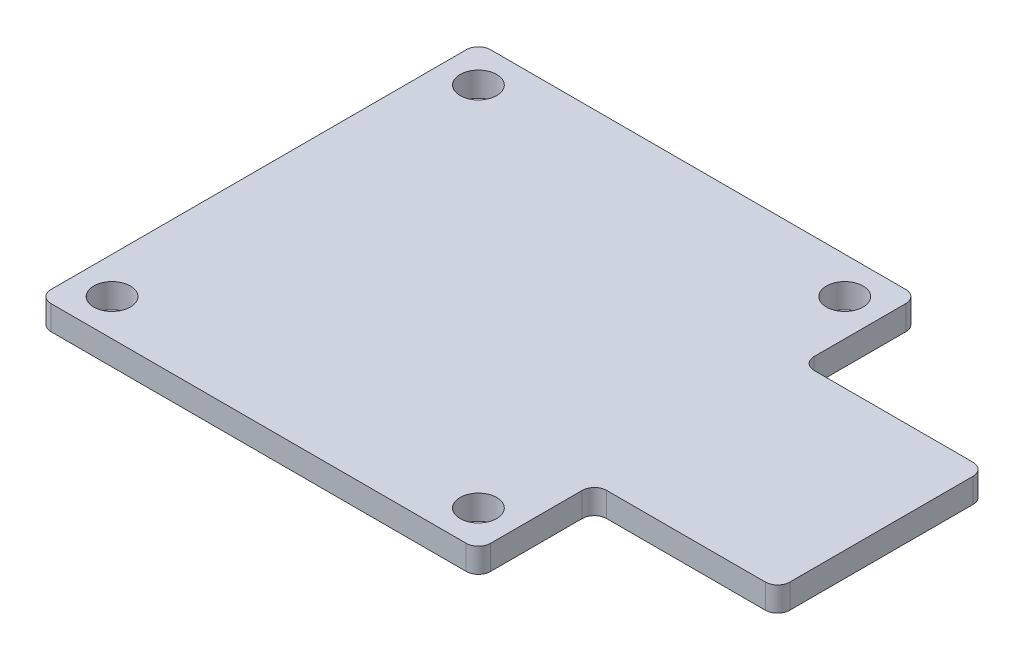
ISO-10303-21;
HEADER;
FILE_DESCRIPTION(('STEP AP214'),'2;1');
FILE_NAME('part.step','',(''),(''),'','','');
FILE_SCHEMA(('AUTOMOTIVE_DESIGN { 1 0 10303 214 1 1 1 1 }'));
ENDSEC;
DATA;
#1=APPLICATION_CONTEXT('core data for automotive mechanical design processes');
#2=APPLICATION_PROTOCOL_DEFINITION('international standard','automotive_design',2000,#1);
#3=PRODUCT_CONTEXT('',#1,'mechanical');
#4=PRODUCT('Part','Part','',(#3));
#5=PRODUCT_RELATED_PRODUCT_CATEGORY('part','',(#4));
#6=PRODUCT_DEFINITION_FORMATION('','',#4);
#7=PRODUCT_DEFINITION_CONTEXT('part definition',#1,'design');
#8=PRODUCT_DEFINITION('design','',#6,#7);
#9=PRODUCT_DEFINITION_SHAPE('','',#8);
#10=(LENGTH_UNIT() NAMED_UNIT(*) SI_UNIT(.MILLI.,.METRE.));
#11=(NAMED_UNIT(*) PLANE_ANGLE_UNIT() SI_UNIT($,.RADIAN.));
#12=(NAMED_UNIT(*) SI_UNIT($,.STERADIAN.) SOLID_ANGLE_UNIT());
#13=UNCERTAINTY_MEASURE_WITH_UNIT(LENGTH_MEASURE(1.E-05),#10,'distance_accuracy_value','');
#14=(GEOMETRIC_REPRESENTATION_CONTEXT(3) GLOBAL_UNCERTAINTY_ASSIGNED_CONTEXT((#13)) GLOBAL_UNIT_ASSIGNED_CONTEXT((#10,
#11,#12)) REPRESENTATION_CONTEXT('',''));
#15=CARTESIAN_POINT('',(0.,0.,0.));
#16=DIRECTION('',(0.,0.,1.));
#17=DIRECTION('',(1.,0.,0.));
#18=AXIS2_PLACEMENT_3D('',#15,#16,#17);
#19=CARTESIAN_POINT('',(0.,2.,0.));
#20=DIRECTION('',(0.,0.,-1.));
#21=DIRECTION('',(-1.,0.,0.));
#22=AXIS2_PLACEMENT_3D('',#19,#20,#21);
#23=PLANE('',#22);
#24=DIRECTION('',(1.,0.,0.));
#25=VECTOR('',#24,1.);
#26=CARTESIAN_POINT('',(0.,2.,0.));
#27=LINE('',#26,#25);
#28=CARTESIAN_POINT('',(1.,2.,0.));
#29=VERTEX_POINT('',#28);
#30=CARTESIAN_POINT('',(35.,2.,0.));
#31=VERTEX_POINT('',#30);
#32=EDGE_CURVE('E317',#29,#31,#27,.T.);
#33=ORIENTED_EDGE('',*,*,#32,.F.);
#34=DIRECTION('',(0.,-1.,0.));
#35=VECTOR('',#34,1.);
#36=CARTESIAN_POINT('',(1.,0.,0.));
#37=LINE('',#36,#35);
#38=CARTESIAN_POINT('',(1.,0.,0.));
#39=VERTEX_POINT('',#38);
#40=EDGE_CURVE('E267',#29,#39,#37,.T.);
#41=ORIENTED_EDGE('',*,*,#40,.T.);
#42=DIRECTION('',(1.,0.,0.));
#43=VECTOR('',#42,1.);
#44=CARTESIAN_POINT('',(0.,0.,0.));
#45=LINE('',#44,#43);
#46=CARTESIAN_POINT('',(35.,0.,0.));
#47=VERTEX_POINT('',#46);
#48=EDGE_CURVE('E301',#39,#47,#45,.T.);
#49=ORIENTED_EDGE('',*,*,#48,.T.);
#50=DIRECTION('',(0.,-1.,0.));
#51=VECTOR('',#50,1.);
#52=CARTESIAN_POINT('',(35.,2.,0.));
#53=LINE('',#52,#51);
#54=EDGE_CURVE('E264',#47,#31,#53,.F.);
#55=ORIENTED_EDGE('',*,*,#54,.T.);
#56=EDGE_LOOP('',(#33,#41,#49,#55));
#57=FACE_BOUND('',#56,.T.);
#58=ADVANCED_FACE('F41',(#57),#23,.F.);
#59=CARTESIAN_POINT('',(36.,2.,0.));
#60=DIRECTION('',(-1.,0.,0.));
#61=DIRECTION('',(0.,0.,1.));
#62=AXIS2_PLACEMENT_3D('',#59,#60,#61);
#63=PLANE('',#62);
#64=DIRECTION('',(0.,0.,-1.));
#65=VECTOR('',#64,1.);
#66=CARTESIAN_POINT('',(36.,0.,0.));
#67=LINE('',#66,#65);
#68=CARTESIAN_POINT('',(36.,0.,-1.));
#69=VERTEX_POINT('',#68);
#70=CARTESIAN_POINT('',(36.,0.,-8.5));
#71=VERTEX_POINT('',#70);
#72=EDGE_CURVE('E192',#69,#71,#67,.T.);
#73=ORIENTED_EDGE('',*,*,#72,.T.);
#74=DIRECTION('',(0.,-1.,0.));
#75=VECTOR('',#74,1.);
#76=CARTESIAN_POINT('',(36.,2.,-8.5));
#77=LINE('',#76,#75);
#78=CARTESIAN_POINT('',(36.,2.,-8.5));
#79=VERTEX_POINT('',#78);
#80=EDGE_CURVE('E261',#71,#79,#77,.F.);
#81=ORIENTED_EDGE('',*,*,#80,.T.);
#82=DIRECTION('',(0.,0.,-1.));
#83=VECTOR('',#82,1.);
#84=CARTESIAN_POINT('',(36.,2.,0.));
#85=LINE('',#84,#83);
#86=CARTESIAN_POINT('',(36.,2.,-1.));
#87=VERTEX_POINT('',#86);
#88=EDGE_CURVE('E308',#87,#79,#85,.T.);
#89=ORIENTED_EDGE('',*,*,#88,.F.);
#90=DIRECTION('',(0.,-1.,0.));
#91=VECTOR('',#90,1.);
#92=CARTESIAN_POINT('',(36.,2.,-1.));
#93=LINE('',#92,#91);
#94=EDGE_CURVE('E257',#87,#69,#93,.T.);
#95=ORIENTED_EDGE('',*,*,#94,.T.);
#96=EDGE_LOOP('',(#73,#81,#89,#95));
#97=FACE_BOUND('',#96,.T.);
#98=ADVANCED_FACE('F296',(#97),#63,.F.);
#99=CARTESIAN_POINT('',(0.,2.,-9.5));
#100=DIRECTION('',(0.,0.,-1.));
#101=DIRECTION('',(-1.,0.,0.));
#102=AXIS2_PLACEMENT_3D('',#99,#100,#101);
#103=PLANE('',#102);
#104=DIRECTION('',(1.,0.,0.));
#105=VECTOR('',#104,1.);
#106=CARTESIAN_POINT('',(0.,0.,-9.5));
#107=LINE('',#106,#105);
#108=CARTESIAN_POINT('',(37.,0.,-9.5));
#109=VERTEX_POINT('',#108);
#110=CARTESIAN_POINT('',(50.,0.,-9.5));
#111=VERTEX_POINT('',#110);
#112=EDGE_CURVE('E186',#109,#111,#107,.T.);
#113=ORIENTED_EDGE('',*,*,#112,.T.);
#114=DIRECTION('',(0.,-1.,0.));
#115=VECTOR('',#114,1.);
#116=CARTESIAN_POINT('',(50.,2.,-9.5));
#117=LINE('',#116,#115);
#118=CARTESIAN_POINT('',(50.,2.,-9.5));
#119=VERTEX_POINT('',#118);
#120=EDGE_CURVE('E161',#111,#119,#117,.F.);
#121=ORIENTED_EDGE('',*,*,#120,.T.);
#122=DIRECTION('',(1.,0.,0.));
#123=VECTOR('',#122,1.);
#124=CARTESIAN_POINT('',(0.,2.,-9.5));
#125=LINE('',#124,#123);
#126=CARTESIAN_POINT('',(37.,2.,-9.5));
#127=VERTEX_POINT('',#126);
#128=EDGE_CURVE('E307',#127,#119,#125,.T.);
#129=ORIENTED_EDGE('',*,*,#128,.F.);
#130=DIRECTION('',(0.,-1.,0.));
#131=VECTOR('',#130,1.);
#132=CARTESIAN_POINT('',(37.,0.,-9.5));
#133=LINE('',#132,#131);
#134=EDGE_CURVE('E167',#127,#109,#133,.T.);
#135=ORIENTED_EDGE('',*,*,#134,.T.);
#136=EDGE_LOOP('',(#113,#121,#129,#135));
#137=FACE_BOUND('',#136,.T.);
#138=ADVANCED_FACE('F310',(#137),#103,.F.);
#139=CARTESIAN_POINT('',(51.,2.,0.));
#140=DIRECTION('',(-1.,0.,0.));
#141=DIRECTION('',(0.,0.,1.));
#142=AXIS2_PLACEMENT_3D('',#139,#140,#141);
#143=PLANE('',#142);
#144=DIRECTION('',(0.,0.,-1.));
#145=VECTOR('',#144,1.);
#146=CARTESIAN_POINT('',(51.,2.,0.));
#147=LINE('',#146,#145);
#148=CARTESIAN_POINT('',(51.,2.,-10.5));
#149=VERTEX_POINT('',#148);
#150=CARTESIAN_POINT('',(51.,2.,-25.5));
#151=VERTEX_POINT('',#150);
#152=EDGE_CURVE('E177',#149,#151,#147,.T.);
#153=ORIENTED_EDGE('',*,*,#152,.F.);
#154=DIRECTION('',(0.,-1.,0.));
#155=VECTOR('',#154,1.);
#156=CARTESIAN_POINT('',(51.,2.,-10.5));
#157=LINE('',#156,#155);
#158=CARTESIAN_POINT('',(51.,0.,-10.5));
#159=VERTEX_POINT('',#158);
#160=EDGE_CURVE('E160',#149,#159,#157,.T.);
#161=ORIENTED_EDGE('',*,*,#160,.T.);
#162=DIRECTION('',(0.,0.,-1.));
#163=VECTOR('',#162,1.);
#164=CARTESIAN_POINT('',(51.,0.,0.));
#165=LINE('',#164,#163);
#166=CARTESIAN_POINT('',(51.,0.,-25.5));
#167=VERTEX_POINT('',#166);
#168=EDGE_CURVE('E174',#159,#167,#165,.T.);
#169=ORIENTED_EDGE('',*,*,#168,.T.);
#170=DIRECTION('',(0.,-1.,0.));
#171=VECTOR('',#170,1.);
#172=CARTESIAN_POINT('',(51.,2.,-25.5));
#173=LINE('',#172,#171);
#174=EDGE_CURVE('E180',#167,#151,#173,.F.);
#175=ORIENTED_EDGE('',*,*,#174,.T.);
#176=EDGE_LOOP('',(#153,#161,#169,#175));
#177=FACE_BOUND('',#176,.T.);
#178=ADVANCED_FACE('F173',(#177),#143,.F.);
#179=CARTESIAN_POINT('',(0.,2.,-26.5));
#180=DIRECTION('',(0.,0.,-1.));
#181=DIRECTION('',(-1.,0.,0.));
#182=AXIS2_PLACEMENT_3D('',#179,#180,#181);
#183=PLANE('',#182);
#184=DIRECTION('',(1.,0.,0.));
#185=VECTOR('',#184,1.);
#186=CARTESIAN_POINT('',(0.,2.,-26.5));
#187=LINE('',#186,#185);
#188=CARTESIAN_POINT('',(37.,2.,-26.5));
#189=VERTEX_POINT('',#188);
#190=CARTESIAN_POINT('',(50.,2.,-26.5));
#191=VERTEX_POINT('',#190);
#192=EDGE_CURVE('E315',#189,#191,#187,.T.);
#193=ORIENTED_EDGE('',*,*,#192,.T.);
#194=DIRECTION('',(0.,-1.,0.));
#195=VECTOR('',#194,1.);
#196=CARTESIAN_POINT('',(50.,0.,-26.5));
#197=LINE('',#196,#195);
#198=CARTESIAN_POINT('',(50.,0.,-26.5));
#199=VERTEX_POINT('',#198);
#200=EDGE_CURVE('E246',#191,#199,#197,.T.);
#201=ORIENTED_EDGE('',*,*,#200,.T.);
#202=DIRECTION('',(1.,0.,0.));
#203=VECTOR('',#202,1.);
#204=CARTESIAN_POINT('',(0.,0.,-26.5));
#205=LINE('',#204,#203);
#206=CARTESIAN_POINT('',(37.,0.,-26.5));
#207=VERTEX_POINT('',#206);
#208=EDGE_CURVE('E185',#207,#199,#205,.T.);
#209=ORIENTED_EDGE('',*,*,#208,.F.);
#210=DIRECTION('',(0.,-1.,0.));
#211=VECTOR('',#210,1.);
#212=CARTESIAN_POINT('',(37.,2.,-26.5));
#213=LINE('',#212,#211);
#214=EDGE_CURVE('E243',#207,#189,#213,.F.);
#215=ORIENTED_EDGE('',*,*,#214,.T.);
#216=EDGE_LOOP('',(#193,#201,#209,#215));
#217=FACE_BOUND('',#216,.T.);
#218=ADVANCED_FACE('F466',(#217),#183,.T.);
#219=CARTESIAN_POINT('',(36.,2.,-27.5));
#220=VERTEX_POINT('',#219);
#221=CARTESIAN_POINT('',(36.,2.,-35.));
#222=VERTEX_POINT('',#221);
#223=EDGE_CURVE('E319',#220,#222,#85,.T.);
#224=ORIENTED_EDGE('',*,*,#223,.F.);
#225=DIRECTION('',(0.,-1.,0.));
#226=VECTOR('',#225,1.);
#227=CARTESIAN_POINT('',(36.,2.,-27.5));
#228=LINE('',#227,#226);
#229=CARTESIAN_POINT('',(36.,0.,-27.5));
#230=VERTEX_POINT('',#229);
#231=EDGE_CURVE('E253',#220,#230,#228,.T.);
#232=ORIENTED_EDGE('',*,*,#231,.T.);
#233=CARTESIAN_POINT('',(36.,0.,-35.));
#234=VERTEX_POINT('',#233);
#235=EDGE_CURVE('E190',#230,#234,#67,.T.);
#236=ORIENTED_EDGE('',*,*,#235,.T.);
#237=DIRECTION('',(0.,-1.,0.));
#238=VECTOR('',#237,1.);
#239=CARTESIAN_POINT('',(36.,2.,-35.));
#240=LINE('',#239,#238);
#241=EDGE_CURVE('E250',#234,#222,#240,.F.);
#242=ORIENTED_EDGE('',*,*,#241,.T.);
#243=EDGE_LOOP('',(#224,#232,#236,#242));
#244=FACE_BOUND('',#243,.T.);
#245=ADVANCED_FACE('F414',(#244),#63,.F.);
#246=CARTESIAN_POINT('',(0.,2.,-36.));
#247=DIRECTION('',(0.,0.,-1.));
#248=DIRECTION('',(-1.,0.,0.));
#249=AXIS2_PLACEMENT_3D('',#246,#247,#248);
#250=PLANE('',#249);
#251=DIRECTION('',(1.,0.,0.));
#252=VECTOR('',#251,1.);
#253=CARTESIAN_POINT('',(0.,2.,-36.));
#254=LINE('',#253,#252);
#255=CARTESIAN_POINT('',(1.,2.,-36.));
#256=VERTEX_POINT('',#255);
#257=CARTESIAN_POINT('',(35.,2.,-36.));
#258=VERTEX_POINT('',#257);
#259=EDGE_CURVE('E325',#256,#258,#254,.T.);
#260=ORIENTED_EDGE('',*,*,#259,.T.);
#261=DIRECTION('',(0.,-1.,0.));
#262=VECTOR('',#261,1.);
#263=CARTESIAN_POINT('',(35.,0.,-36.));
#264=LINE('',#263,#262);
#265=CARTESIAN_POINT('',(35.,0.,-36.));
#266=VERTEX_POINT('',#265);
#267=EDGE_CURVE('E280',#258,#266,#264,.T.);
#268=ORIENTED_EDGE('',*,*,#267,.T.);
#269=DIRECTION('',(1.,0.,0.));
#270=VECTOR('',#269,1.);
#271=CARTESIAN_POINT('',(0.,0.,-36.));
#272=LINE('',#271,#270);
#273=CARTESIAN_POINT('',(1.,0.,-36.));
#274=VERTEX_POINT('',#273);
#275=EDGE_CURVE('E196',#274,#266,#272,.T.);
#276=ORIENTED_EDGE('',*,*,#275,.F.);
#277=DIRECTION('',(0.,-1.,0.));
#278=VECTOR('',#277,1.);
#279=CARTESIAN_POINT('',(1.,2.,-36.));
#280=LINE('',#279,#278);
#281=EDGE_CURVE('E277',#274,#256,#280,.F.);
#282=ORIENTED_EDGE('',*,*,#281,.T.);
#283=EDGE_LOOP('',(#260,#268,#276,#282));
#284=FACE_BOUND('',#283,.T.);
#285=ADVANCED_FACE('F394',(#284),#250,.T.);
#286=CARTESIAN_POINT('',(3.,2.,-33.));
#287=DIRECTION('',(0.,-1.,0.));
#288=DIRECTION('',(0.,0.,-1.));
#289=AXIS2_PLACEMENT_3D('',#286,#287,#288);
#290=CYLINDRICAL_SURFACE('',#289,1.5);
#291=CARTESIAN_POINT('',(3.,2.,-33.));
#292=DIRECTION('',(0.,1.,0.));
#293=DIRECTION('',(0.,0.,1.));
#294=AXIS2_PLACEMENT_3D('',#291,#292,#293);
#295=CIRCLE('',#294,1.5);
#296=CARTESIAN_POINT('',(3.,2.,-31.5));
#297=VERTEX_POINT('',#296);
#298=EDGE_CURVE('E360',#297,#297,#295,.T.);
#299=ORIENTED_EDGE('',*,*,#298,.T.);
#300=EDGE_LOOP('',(#299));
#301=FACE_BOUND('',#300,.T.);
#302=CARTESIAN_POINT('',(3.,0.,-33.));
#303=DIRECTION('',(0.,1.,0.));
#304=DIRECTION('',(0.,0.,1.));
#305=AXIS2_PLACEMENT_3D('',#302,#303,#304);
#306=CIRCLE('',#305,1.5);
#307=CARTESIAN_POINT('',(3.,0.,-31.5));
#308=VERTEX_POINT('',#307);
#309=EDGE_CURVE('E343',#308,#308,#306,.T.);
#310=ORIENTED_EDGE('',*,*,#309,.F.);
#311=EDGE_LOOP('',(#310));
#312=FACE_BOUND('',#311,.T.);
#313=ADVANCED_FACE('F390',(#301,#312),#290,.F.);
#314=CARTESIAN_POINT('',(33.,2.,-33.));
#315=DIRECTION('',(0.,-1.,0.));
#316=DIRECTION('',(0.,0.,-1.));
#317=AXIS2_PLACEMENT_3D('',#314,#315,#316);
#318=CYLINDRICAL_SURFACE('',#317,1.5);
#319=CARTESIAN_POINT('',(33.,2.,-33.));
#320=DIRECTION('',(0.,1.,0.));
#321=DIRECTION('',(0.,0.,1.));
#322=AXIS2_PLACEMENT_3D('',#319,#320,#321);
#323=CIRCLE('',#322,1.5);
#324=CARTESIAN_POINT('',(33.,2.,-31.5));
#325=VERTEX_POINT('',#324);
#326=EDGE_CURVE('E363',#325,#325,#323,.T.);
#327=ORIENTED_EDGE('',*,*,#326,.T.);
#328=EDGE_LOOP('',(#327));
#329=FACE_BOUND('',#328,.T.);
#330=CARTESIAN_POINT('',(33.,0.,-33.));
#331=DIRECTION('',(0.,1.,0.));
#332=DIRECTION('',(0.,0.,1.));
#333=AXIS2_PLACEMENT_3D('',#330,#331,#332);
#334=CIRCLE('',#333,1.5);
#335=CARTESIAN_POINT('',(33.,0.,-31.5));
#336=VERTEX_POINT('',#335);
#337=EDGE_CURVE('E339',#336,#336,#334,.T.);
#338=ORIENTED_EDGE('',*,*,#337,.F.);
#339=EDGE_LOOP('',(#338));
#340=FACE_BOUND('',#339,.T.);
#341=ADVANCED_FACE('F393',(#329,#340),#318,.F.);
#342=CARTESIAN_POINT('',(3.,2.,-3.));
#343=DIRECTION('',(0.,-1.,0.));
#344=DIRECTION('',(0.,0.,-1.));
#345=AXIS2_PLACEMENT_3D('',#342,#343,#344);
#346=CYLINDRICAL_SURFACE('',#345,1.5);
#347=CARTESIAN_POINT('',(3.,2.,-3.));
#348=DIRECTION('',(0.,1.,0.));
#349=DIRECTION('',(0.,0.,1.));
#350=AXIS2_PLACEMENT_3D('',#347,#348,#349);
#351=CIRCLE('',#350,1.5);
#352=CARTESIAN_POINT('',(3.,2.,-1.5));
#353=VERTEX_POINT('',#352);
#354=EDGE_CURVE('E369',#353,#353,#351,.T.);
#355=ORIENTED_EDGE('',*,*,#354,.T.);
#356=EDGE_LOOP('',(#355));
#357=FACE_BOUND('',#356,.T.);
#358=CARTESIAN_POINT('',(3.,0.,-3.));
#359=DIRECTION('',(0.,1.,0.));
#360=DIRECTION('',(0.,0.,1.));
#361=AXIS2_PLACEMENT_3D('',#358,#359,#360);
#362=CIRCLE('',#361,1.5);
#363=CARTESIAN_POINT('',(3.,0.,-1.5));
#364=VERTEX_POINT('',#363);
#365=EDGE_CURVE('E335',#364,#364,#362,.T.);
#366=ORIENTED_EDGE('',*,*,#365,.F.);
#367=EDGE_LOOP('',(#366));
#368=FACE_BOUND('',#367,.T.);
#369=ADVANCED_FACE('F420',(#357,#368),#346,.F.);
#370=CARTESIAN_POINT('',(33.,2.,-3.));
#371=DIRECTION('',(0.,-1.,0.));
#372=DIRECTION('',(0.,0.,-1.));
#373=AXIS2_PLACEMENT_3D('',#370,#371,#372);
#374=CYLINDRICAL_SURFACE('',#373,1.5);
#375=CARTESIAN_POINT('',(33.,2.,-3.));
#376=DIRECTION('',(0.,1.,0.));
#377=DIRECTION('',(0.,0.,1.));
#378=AXIS2_PLACEMENT_3D('',#375,#376,#377);
#379=CIRCLE('',#378,1.5);
#380=CARTESIAN_POINT('',(33.,2.,-1.5));
#381=VERTEX_POINT('',#380);
#382=EDGE_CURVE('E204',#381,#381,#379,.T.);
#383=ORIENTED_EDGE('',*,*,#382,.T.);
#384=EDGE_LOOP('',(#383));
#385=FACE_BOUND('',#384,.T.);
#386=CARTESIAN_POINT('',(33.,0.,-3.));
#387=DIRECTION('',(0.,1.,0.));
#388=DIRECTION('',(0.,0.,1.));
#389=AXIS2_PLACEMENT_3D('',#386,#387,#388);
#390=CIRCLE('',#389,1.5);
#391=CARTESIAN_POINT('',(33.,0.,-1.5));
#392=VERTEX_POINT('',#391);
#393=EDGE_CURVE('E331',#392,#392,#390,.T.);
#394=ORIENTED_EDGE('',*,*,#393,.F.);
#395=EDGE_LOOP('',(#394));
#396=FACE_BOUND('',#395,.T.);
#397=ADVANCED_FACE('F377',(#385,#396),#374,.F.);
#398=CARTESIAN_POINT('',(0.,2.,0.));
#399=DIRECTION('',(-1.,0.,0.));
#400=DIRECTION('',(0.,0.,1.));
#401=AXIS2_PLACEMENT_3D('',#398,#399,#400);
#402=PLANE('',#401);
#403=DIRECTION('',(0.,0.,-1.));
#404=VECTOR('',#403,1.);
#405=CARTESIAN_POINT('',(0.,0.,0.));
#406=LINE('',#405,#404);
#407=CARTESIAN_POINT('',(0.,0.,-1.));
#408=VERTEX_POINT('',#407);
#409=CARTESIAN_POINT('',(0.,0.,-35.));
#410=VERTEX_POINT('',#409);
#411=EDGE_CURVE('E200',#408,#410,#406,.T.);
#412=ORIENTED_EDGE('',*,*,#411,.F.);
#413=DIRECTION('',(0.,-1.,0.));
#414=VECTOR('',#413,1.);
#415=CARTESIAN_POINT('',(0.,2.,-1.));
#416=LINE('',#415,#414);
#417=CARTESIAN_POINT('',(0.,2.,-1.));
#418=VERTEX_POINT('',#417);
#419=EDGE_CURVE('E64',#408,#418,#416,.F.);
#420=ORIENTED_EDGE('',*,*,#419,.T.);
#421=DIRECTION('',(0.,0.,-1.));
#422=VECTOR('',#421,1.);
#423=CARTESIAN_POINT('',(0.,2.,0.));
#424=LINE('',#423,#422);
#425=CARTESIAN_POINT('',(0.,2.,-35.));
#426=VERTEX_POINT('',#425);
#427=EDGE_CURVE('E206',#418,#426,#424,.T.);
#428=ORIENTED_EDGE('',*,*,#427,.T.);
#429=DIRECTION('',(0.,-1.,0.));
#430=VECTOR('',#429,1.);
#431=CARTESIAN_POINT('',(0.,2.,-35.));
#432=LINE('',#431,#430);
#433=EDGE_CURVE('E271',#426,#410,#432,.T.);
#434=ORIENTED_EDGE('',*,*,#433,.T.);
#435=EDGE_LOOP('',(#412,#420,#428,#434));
#436=FACE_BOUND('',#435,.T.);
#437=ADVANCED_FACE('F382',(#436),#402,.T.);
#438=CARTESIAN_POINT('',(0.,2.,0.));
#439=DIRECTION('',(0.,1.,0.));
#440=DIRECTION('',(0.,0.,1.));
#441=AXIS2_PLACEMENT_3D('',#438,#439,#440);
#442=PLANE('',#441);
#443=ORIENTED_EDGE('',*,*,#382,.F.);
#444=EDGE_LOOP('',(#443));
#445=FACE_BOUND('',#444,.T.);
#446=ORIENTED_EDGE('',*,*,#354,.F.);
#447=EDGE_LOOP('',(#446));
#448=FACE_BOUND('',#447,.T.);
#449=ORIENTED_EDGE('',*,*,#326,.F.);
#450=EDGE_LOOP('',(#449));
#451=FACE_BOUND('',#450,.T.);
#452=ORIENTED_EDGE('',*,*,#298,.F.);
#453=EDGE_LOOP('',(#452));
#454=FACE_BOUND('',#453,.T.);
#455=ORIENTED_EDGE('',*,*,#128,.T.);
#456=CARTESIAN_POINT('',(50.,2.,-10.5));
#457=DIRECTION('',(0.,1.,0.));
#458=DIRECTION('',(0.,0.,1.));
#459=AXIS2_PLACEMENT_3D('',#456,#457,#458);
#460=CIRCLE('',#459,1.);
#461=EDGE_CURVE('E240',#119,#149,#460,.T.);
#462=ORIENTED_EDGE('',*,*,#461,.T.);
#463=ORIENTED_EDGE('',*,*,#152,.T.);
#464=CARTESIAN_POINT('',(50.,2.,-25.5));
#465=DIRECTION('',(0.,1.,0.));
#466=DIRECTION('',(0.,0.,1.));
#467=AXIS2_PLACEMENT_3D('',#464,#465,#466);
#468=CIRCLE('',#467,1.);
#469=EDGE_CURVE('E237',#151,#191,#468,.T.);
#470=ORIENTED_EDGE('',*,*,#469,.T.);
#471=ORIENTED_EDGE('',*,*,#192,.F.);
#472=CARTESIAN_POINT('',(37.,2.,-27.5));
#473=DIRECTION('',(0.,1.,0.));
#474=DIRECTION('',(0.,0.,1.));
#475=AXIS2_PLACEMENT_3D('',#472,#473,#474);
#476=CIRCLE('',#475,1.);
#477=EDGE_CURVE('E287',#189,#220,#476,.F.);
#478=ORIENTED_EDGE('',*,*,#477,.T.);
#479=ORIENTED_EDGE('',*,*,#223,.T.);
#480=CARTESIAN_POINT('',(35.,2.,-35.));
#481=DIRECTION('',(0.,1.,0.));
#482=DIRECTION('',(0.,0.,1.));
#483=AXIS2_PLACEMENT_3D('',#480,#481,#482);
#484=CIRCLE('',#483,1.);
#485=EDGE_CURVE('E228',#222,#258,#484,.T.);
#486=ORIENTED_EDGE('',*,*,#485,.T.);
#487=ORIENTED_EDGE('',*,*,#259,.F.);
#488=CARTESIAN_POINT('',(1.,2.,-35.));
#489=DIRECTION('',(0.,1.,0.));
#490=DIRECTION('',(0.,0.,1.));
#491=AXIS2_PLACEMENT_3D('',#488,#489,#490);
#492=CIRCLE('',#491,1.);
#493=EDGE_CURVE('E57',#256,#426,#492,.T.);
#494=ORIENTED_EDGE('',*,*,#493,.T.);
#495=ORIENTED_EDGE('',*,*,#427,.F.);
#496=CARTESIAN_POINT('',(1.,2.,-1.));
#497=DIRECTION('',(0.,1.,0.));
#498=DIRECTION('',(0.,0.,1.));
#499=AXIS2_PLACEMENT_3D('',#496,#497,#498);
#500=CIRCLE('',#499,1.);
#501=EDGE_CURVE('E234',#418,#29,#500,.T.);
#502=ORIENTED_EDGE('',*,*,#501,.T.);
#503=ORIENTED_EDGE('',*,*,#32,.T.);
#504=CARTESIAN_POINT('',(35.,2.,-1.));
#505=DIRECTION('',(0.,1.,0.));
#506=DIRECTION('',(0.,0.,1.));
#507=AXIS2_PLACEMENT_3D('',#504,#505,#506);
#508=CIRCLE('',#507,1.);
#509=EDGE_CURVE('E231',#31,#87,#508,.T.);
#510=ORIENTED_EDGE('',*,*,#509,.T.);
#511=ORIENTED_EDGE('',*,*,#88,.T.);
#512=CARTESIAN_POINT('',(37.,2.,-8.5));
#513=DIRECTION('',(0.,1.,0.));
#514=DIRECTION('',(0.,0.,1.));
#515=AXIS2_PLACEMENT_3D('',#512,#513,#514);
#516=CIRCLE('',#515,1.);
#517=EDGE_CURVE('E11',#79,#127,#516,.F.);
#518=ORIENTED_EDGE('',*,*,#517,.T.);
#519=EDGE_LOOP('',(#455,#462,#463,#470,#471,#478,#479,#486,#487,#494,#495,#502,#503,#510,#511,#518));
#520=FACE_BOUND('',#519,.T.);
#521=ADVANCED_FACE('F306',(#445,#448,#451,#454,#520),#442,.T.);
#522=CARTESIAN_POINT('',(0.,0.,0.));
#523=DIRECTION('',(0.,1.,0.));
#524=DIRECTION('',(0.,0.,1.));
#525=AXIS2_PLACEMENT_3D('',#522,#523,#524);
#526=PLANE('',#525);
#527=ORIENTED_EDGE('',*,*,#393,.T.);
#528=EDGE_LOOP('',(#527));
#529=FACE_BOUND('',#528,.T.);
#530=ORIENTED_EDGE('',*,*,#365,.T.);
#531=EDGE_LOOP('',(#530));
#532=FACE_BOUND('',#531,.T.);
#533=ORIENTED_EDGE('',*,*,#337,.T.);
#534=EDGE_LOOP('',(#533));
#535=FACE_BOUND('',#534,.T.);
#536=ORIENTED_EDGE('',*,*,#309,.T.);
#537=EDGE_LOOP('',(#536));
#538=FACE_BOUND('',#537,.T.);
#539=ORIENTED_EDGE('',*,*,#168,.F.);
#540=CARTESIAN_POINT('',(50.,0.,-10.5));
#541=DIRECTION('',(0.,1.,0.));
#542=DIRECTION('',(0.,0.,1.));
#543=AXIS2_PLACEMENT_3D('',#540,#541,#542);
#544=CIRCLE('',#543,1.);
#545=EDGE_CURVE('E156',#159,#111,#544,.F.);
#546=ORIENTED_EDGE('',*,*,#545,.T.);
#547=ORIENTED_EDGE('',*,*,#112,.F.);
#548=CARTESIAN_POINT('',(37.,0.,-8.5));
#549=DIRECTION('',(0.,1.,0.));
#550=DIRECTION('',(0.,0.,1.));
#551=AXIS2_PLACEMENT_3D('',#548,#549,#550);
#552=CIRCLE('',#551,1.);
#553=EDGE_CURVE('E50',#109,#71,#552,.T.);
#554=ORIENTED_EDGE('',*,*,#553,.T.);
#555=ORIENTED_EDGE('',*,*,#72,.F.);
#556=CARTESIAN_POINT('',(35.,0.,-1.));
#557=DIRECTION('',(0.,1.,0.));
#558=DIRECTION('',(0.,0.,1.));
#559=AXIS2_PLACEMENT_3D('',#556,#557,#558);
#560=CIRCLE('',#559,1.);
#561=EDGE_CURVE('E213',#69,#47,#560,.F.);
#562=ORIENTED_EDGE('',*,*,#561,.T.);
#563=ORIENTED_EDGE('',*,*,#48,.F.);
#564=CARTESIAN_POINT('',(1.,0.,-1.));
#565=DIRECTION('',(0.,1.,0.));
#566=DIRECTION('',(0.,0.,1.));
#567=AXIS2_PLACEMENT_3D('',#564,#565,#566);
#568=CIRCLE('',#567,1.);
#569=EDGE_CURVE('E216',#39,#408,#568,.F.);
#570=ORIENTED_EDGE('',*,*,#569,.T.);
#571=ORIENTED_EDGE('',*,*,#411,.T.);
#572=CARTESIAN_POINT('',(1.,0.,-35.));
#573=DIRECTION('',(0.,1.,0.));
#574=DIRECTION('',(0.,0.,1.));
#575=AXIS2_PLACEMENT_3D('',#572,#573,#574);
#576=CIRCLE('',#575,1.);
#577=EDGE_CURVE('E179',#410,#274,#576,.F.);
#578=ORIENTED_EDGE('',*,*,#577,.T.);
#579=ORIENTED_EDGE('',*,*,#275,.T.);
#580=CARTESIAN_POINT('',(35.,0.,-35.));
#581=DIRECTION('',(0.,1.,0.));
#582=DIRECTION('',(0.,0.,1.));
#583=AXIS2_PLACEMENT_3D('',#580,#581,#582);
#584=CIRCLE('',#583,1.);
#585=EDGE_CURVE('E210',#266,#234,#584,.F.);
#586=ORIENTED_EDGE('',*,*,#585,.T.);
#587=ORIENTED_EDGE('',*,*,#235,.F.);
#588=CARTESIAN_POINT('',(37.,0.,-27.5));
#589=DIRECTION('',(0.,1.,0.));
#590=DIRECTION('',(0.,0.,1.));
#591=AXIS2_PLACEMENT_3D('',#588,#589,#590);
#592=CIRCLE('',#591,1.);
#593=EDGE_CURVE('E284',#230,#207,#592,.T.);
#594=ORIENTED_EDGE('',*,*,#593,.T.);
#595=ORIENTED_EDGE('',*,*,#208,.T.);
#596=CARTESIAN_POINT('',(50.,0.,-25.5));
#597=DIRECTION('',(0.,1.,0.));
#598=DIRECTION('',(0.,0.,1.));
#599=AXIS2_PLACEMENT_3D('',#596,#597,#598);
#600=CIRCLE('',#599,1.);
#601=EDGE_CURVE('E168',#199,#167,#600,.F.);
#602=ORIENTED_EDGE('',*,*,#601,.T.);
#603=EDGE_LOOP('',(#539,#546,#547,#554,#555,#562,#563,#570,#571,#578,#579,#586,#587,#594,#595,#602));
#604=FACE_BOUND('',#603,.T.);
#605=ADVANCED_FACE('F182',(#529,#532,#535,#538,#604),#526,.F.);
#606=CARTESIAN_POINT('',(50.,2.,-10.5));
#607=DIRECTION('',(0.,-1.,0.));
#608=DIRECTION('',(0.,0.,-1.));
#609=AXIS2_PLACEMENT_3D('',#606,#607,#608);
#610=CYLINDRICAL_SURFACE('',#609,1.);
#611=ORIENTED_EDGE('',*,*,#461,.F.);
#612=ORIENTED_EDGE('',*,*,#120,.F.);
#613=ORIENTED_EDGE('',*,*,#545,.F.);
#614=ORIENTED_EDGE('',*,*,#160,.F.);
#615=EDGE_LOOP('',(#611,#612,#613,#614));
#616=FACE_BOUND('',#615,.T.);
#617=ADVANCED_FACE('F159',(#616),#610,.T.);
#618=CARTESIAN_POINT('',(50.,2.,-25.5));
#619=DIRECTION('',(0.,1.,0.));
#620=DIRECTION('',(0.,0.,1.));
#621=AXIS2_PLACEMENT_3D('',#618,#619,#620);
#622=CYLINDRICAL_SURFACE('',#621,1.);
#623=ORIENTED_EDGE('',*,*,#469,.F.);
#624=ORIENTED_EDGE('',*,*,#174,.F.);
#625=ORIENTED_EDGE('',*,*,#601,.F.);
#626=ORIENTED_EDGE('',*,*,#200,.F.);
#627=EDGE_LOOP('',(#623,#624,#625,#626));
#628=FACE_BOUND('',#627,.T.);
#629=ADVANCED_FACE('F404',(#628),#622,.T.);
#630=CARTESIAN_POINT('',(37.,2.,-27.5));
#631=DIRECTION('',(0.,-1.,0.));
#632=DIRECTION('',(0.,0.,-1.));
#633=AXIS2_PLACEMENT_3D('',#630,#631,#632);
#634=CYLINDRICAL_SURFACE('',#633,1.);
#635=ORIENTED_EDGE('',*,*,#477,.F.);
#636=ORIENTED_EDGE('',*,*,#214,.F.);
#637=ORIENTED_EDGE('',*,*,#593,.F.);
#638=ORIENTED_EDGE('',*,*,#231,.F.);
#639=EDGE_LOOP('',(#635,#636,#637,#638));
#640=FACE_BOUND('',#639,.T.);
#641=ADVANCED_FACE('F429',(#640),#634,.F.);
#642=CARTESIAN_POINT('',(37.,2.,-8.5));
#643=DIRECTION('',(0.,1.,0.));
#644=DIRECTION('',(0.,0.,1.));
#645=AXIS2_PLACEMENT_3D('',#642,#643,#644);
#646=CYLINDRICAL_SURFACE('',#645,1.);
#647=ORIENTED_EDGE('',*,*,#517,.F.);
#648=ORIENTED_EDGE('',*,*,#80,.F.);
#649=ORIENTED_EDGE('',*,*,#553,.F.);
#650=ORIENTED_EDGE('',*,*,#134,.F.);
#651=EDGE_LOOP('',(#647,#648,#649,#650));
#652=FACE_BOUND('',#651,.T.);
#653=ADVANCED_FACE('F303',(#652),#646,.F.);
#654=CARTESIAN_POINT('',(1.,2.,-1.));
#655=DIRECTION('',(0.,1.,0.));
#656=DIRECTION('',(0.,0.,1.));
#657=AXIS2_PLACEMENT_3D('',#654,#655,#656);
#658=CYLINDRICAL_SURFACE('',#657,1.);
#659=ORIENTED_EDGE('',*,*,#501,.F.);
#660=ORIENTED_EDGE('',*,*,#419,.F.);
#661=ORIENTED_EDGE('',*,*,#569,.F.);
#662=ORIENTED_EDGE('',*,*,#40,.F.);
#663=EDGE_LOOP('',(#659,#660,#661,#662));
#664=FACE_BOUND('',#663,.T.);
#665=ADVANCED_FACE('F436',(#664),#658,.T.);
#666=CARTESIAN_POINT('',(35.,2.,-1.));
#667=DIRECTION('',(0.,-1.,0.));
#668=DIRECTION('',(0.,0.,-1.));
#669=AXIS2_PLACEMENT_3D('',#666,#667,#668);
#670=CYLINDRICAL_SURFACE('',#669,1.);
#671=ORIENTED_EDGE('',*,*,#509,.F.);
#672=ORIENTED_EDGE('',*,*,#54,.F.);
#673=ORIENTED_EDGE('',*,*,#561,.F.);
#674=ORIENTED_EDGE('',*,*,#94,.F.);
#675=EDGE_LOOP('',(#671,#672,#673,#674));
#676=FACE_BOUND('',#675,.T.);
#677=ADVANCED_FACE('F357',(#676),#670,.T.);
#678=CARTESIAN_POINT('',(35.,2.,-35.));
#679=DIRECTION('',(0.,1.,0.));
#680=DIRECTION('',(0.,0.,1.));
#681=AXIS2_PLACEMENT_3D('',#678,#679,#680);
#682=CYLINDRICAL_SURFACE('',#681,1.);
#683=ORIENTED_EDGE('',*,*,#485,.F.);
#684=ORIENTED_EDGE('',*,*,#241,.F.);
#685=ORIENTED_EDGE('',*,*,#585,.F.);
#686=ORIENTED_EDGE('',*,*,#267,.F.);
#687=EDGE_LOOP('',(#683,#684,#685,#686));
#688=FACE_BOUND('',#687,.T.);
#689=ADVANCED_FACE('F441',(#688),#682,.T.);
#690=CARTESIAN_POINT('',(1.,2.,-35.));
#691=DIRECTION('',(0.,-1.,0.));
#692=DIRECTION('',(0.,0.,-1.));
#693=AXIS2_PLACEMENT_3D('',#690,#691,#692);
#694=CYLINDRICAL_SURFACE('',#693,1.);
#695=ORIENTED_EDGE('',*,*,#493,.F.);
#696=ORIENTED_EDGE('',*,*,#281,.F.);
#697=ORIENTED_EDGE('',*,*,#577,.F.);
#698=ORIENTED_EDGE('',*,*,#433,.F.);
#699=EDGE_LOOP('',(#695,#696,#697,#698));
#700=FACE_BOUND('',#699,.T.);
#701=ADVANCED_FACE('F43',(#700),#694,.T.);
#702=CLOSED_SHELL('',(#58,#98,#138,#178,#218,#245,#285,#313,#341,#369,#397,#437,#521,#605,#617,
#629,#641,#653,#665,#677,#689,#701));
#703=MANIFOLD_SOLID_BREP('B2',#702);
#704=ADVANCED_BREP_SHAPE_REPRESENTATION('',(#18,#703),#14);
#705=SHAPE_DEFINITION_REPRESENTATION(#9,#704);
ENDSEC;
END-ISO-10303-21;
